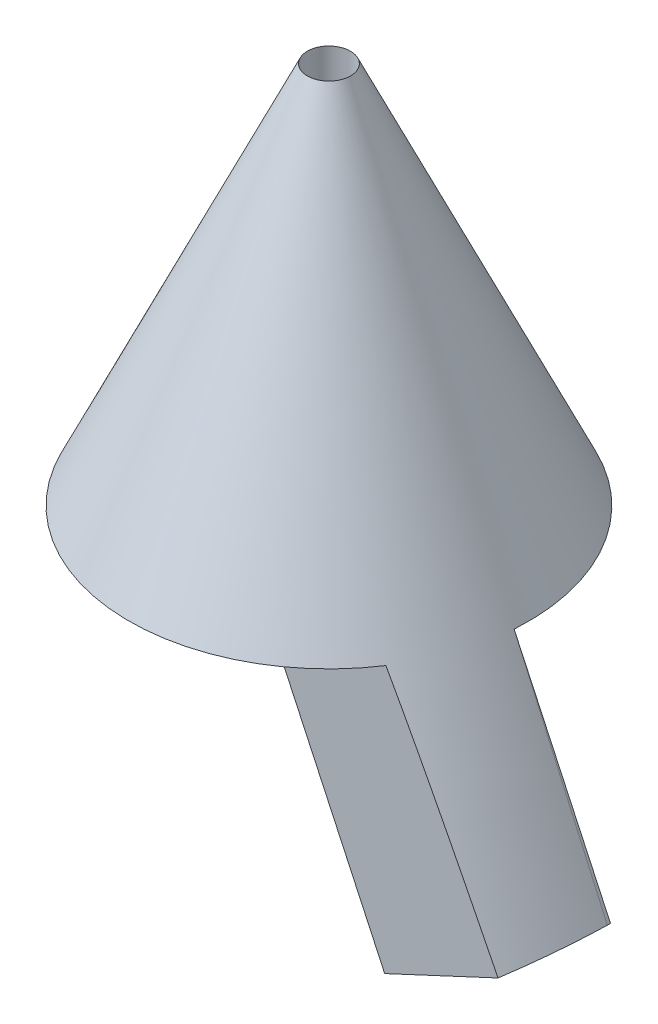
ISO-10303-21;
HEADER;
FILE_DESCRIPTION(('STEP AP214'),'2;1');
FILE_NAME('part.step','',(''),(''),'','','');
FILE_SCHEMA(('AUTOMOTIVE_DESIGN { 1 0 10303 214 1 1 1 1 }'));
ENDSEC;
DATA;
#1=APPLICATION_CONTEXT('core data for automotive mechanical design processes');
#2=APPLICATION_PROTOCOL_DEFINITION('international standard','automotive_design',2000,#1);
#3=PRODUCT_CONTEXT('',#1,'mechanical');
#4=PRODUCT('Part','Part','',(#3));
#5=PRODUCT_RELATED_PRODUCT_CATEGORY('part','',(#4));
#6=PRODUCT_DEFINITION_FORMATION('','',#4);
#7=PRODUCT_DEFINITION_CONTEXT('part definition',#1,'design');
#8=PRODUCT_DEFINITION('design','',#6,#7);
#9=PRODUCT_DEFINITION_SHAPE('','',#8);
#10=(LENGTH_UNIT() NAMED_UNIT(*) SI_UNIT(.MILLI.,.METRE.));
#11=(NAMED_UNIT(*) PLANE_ANGLE_UNIT() SI_UNIT($,.RADIAN.));
#12=(NAMED_UNIT(*) SI_UNIT($,.STERADIAN.) SOLID_ANGLE_UNIT());
#13=UNCERTAINTY_MEASURE_WITH_UNIT(LENGTH_MEASURE(1.E-05),#10,'distance_accuracy_value','');
#14=(GEOMETRIC_REPRESENTATION_CONTEXT(3) GLOBAL_UNCERTAINTY_ASSIGNED_CONTEXT((#13)) GLOBAL_UNIT_ASSIGNED_CONTEXT((#10,
#11,#12)) REPRESENTATION_CONTEXT('',''));
#15=CARTESIAN_POINT('',(0.,0.,0.));
#16=DIRECTION('',(0.,0.,1.));
#17=DIRECTION('',(1.,0.,0.));
#18=AXIS2_PLACEMENT_3D('',#15,#16,#17);
#19=CARTESIAN_POINT('',(30.9189100850161,-21.5962463131786,11.5));
#20=DIRECTION('',(-0.422618261740701,0.906307787036649,0.));
#21=DIRECTION('',(-0.906307787036649,-0.422618261740701,0.));
#22=AXIS2_PLACEMENT_3D('',#19,#20,#21);
#23=PLANE('',#22);
#24=CARTESIAN_POINT('',(-8.6034873437336,-40.02584290285,0.));
#25=DIRECTION('',(-0.422618261740701,0.906307787036649,0.));
#26=DIRECTION('',(-0.906307787036649,-0.422618261740701,0.));
#27=AXIS2_PLACEMENT_3D('',#24,#25,#26);
#28=ELLIPSE('',#27,43.6569827180664,38.6199541404609);
#29=CARTESIAN_POINT('',(29.1682953506833,-22.4125713702769,11.5));
#30=VERTEX_POINT('',#29);
#31=CARTESIAN_POINT('',(30.9189100850161,-21.5962463131786,1.82631427341627));
#32=VERTEX_POINT('',#31);
#33=EDGE_CURVE('E142',#30,#32,#28,.T.);
#34=ORIENTED_EDGE('',*,*,#33,.F.);
#35=DIRECTION('',(0.906307787036649,0.422618261740701,0.));
#36=VECTOR('',#35,1.);
#37=CARTESIAN_POINT('',(30.9189100850161,-21.5962463131786,11.5));
#38=LINE('',#37,#36);
#39=CARTESIAN_POINT('',(17.3242932794663,-27.9355202392891,11.5));
#40=VERTEX_POINT('',#39);
#41=EDGE_CURVE('E153',#40,#30,#38,.T.);
#42=ORIENTED_EDGE('',*,*,#41,.F.);
#43=DIRECTION('',(0.,0.,-1.));
#44=VECTOR('',#43,1.);
#45=CARTESIAN_POINT('',(17.3242932794663,-27.9355202392891,11.5));
#46=LINE('',#45,#44);
#47=CARTESIAN_POINT('',(17.3242932794663,-27.9355202392891,1.5));
#48=VERTEX_POINT('',#47);
#49=EDGE_CURVE('E162',#40,#48,#46,.T.);
#50=ORIENTED_EDGE('',*,*,#49,.T.);
#51=DIRECTION('',(0.906307787036649,0.422618261740701,0.));
#52=VECTOR('',#51,1.);
#53=CARTESIAN_POINT('',(30.9189100850161,-21.5962463131786,1.5));
#54=LINE('',#53,#52);
#55=CARTESIAN_POINT('',(30.9189100850161,-21.5962463131786,1.5));
#56=VERTEX_POINT('',#55);
#57=EDGE_CURVE('E173',#48,#56,#54,.T.);
#58=ORIENTED_EDGE('',*,*,#57,.T.);
#59=DIRECTION('',(0.,0.,-1.));
#60=VECTOR('',#59,1.);
#61=CARTESIAN_POINT('',(30.9189100850161,-21.5962463131786,11.5));
#62=LINE('',#61,#60);
#63=EDGE_CURVE('E155',#32,#56,#62,.T.);
#64=ORIENTED_EDGE('',*,*,#63,.F.);
#65=EDGE_LOOP('',(#34,#42,#50,#58,#64));
#66=FACE_BOUND('',#65,.T.);
#67=ADVANCED_FACE('F37',(#66),#23,.F.);
#68=CARTESIAN_POINT('',(20.8484150417792,0.,11.5));
#69=DIRECTION('',(-0.906307787036649,-0.422618261740701,0.));
#70=DIRECTION('',(0.422618261740701,-0.906307787036649,0.));
#71=AXIS2_PLACEMENT_3D('',#68,#69,#70);
#72=PLANE('',#71);
#73=CARTESIAN_POINT('',(30.9190033465477,-21.5964463131786,1.82631702539581));
#74=CARTESIAN_POINT('',(29.2405257668404,-17.9969395275762,1.77725201658256));
#75=CARTESIAN_POINT('',(27.5620635865221,-14.3974657660699,1.72552615011602));
#76=CARTESIAN_POINT('',(24.2051697310833,-7.19858366166552,1.61675269236349));
#77=CARTESIAN_POINT('',(22.5267380559683,-3.59917531877892,1.55970510014667));
#78=CARTESIAN_POINT('',(20.8483217802476,0.000199999999984483,1.49999664934574));
#79=B_SPLINE_CURVE_WITH_KNOTS('',3,(#73,#74,#75,#76,#77,#78),.UNSPECIFIED.,.F.,.F.,(4,2,4),(0.,
11.9157500788719,23.8315022419474),.UNSPECIFIED.);
#80=CARTESIAN_POINT('',(20.8484150417792,0.,1.50000000000565));
#81=VERTEX_POINT('',#80);
#82=EDGE_CURVE('E156',#32,#81,#79,.T.);
#83=ORIENTED_EDGE('',*,*,#82,.F.);
#84=ORIENTED_EDGE('',*,*,#63,.T.);
#85=DIRECTION('',(-0.422618261740701,0.906307787036649,0.));
#86=VECTOR('',#85,1.);
#87=CARTESIAN_POINT('',(20.8484150417792,0.,1.5));
#88=LINE('',#87,#86);
#89=EDGE_CURVE('E175',#56,#81,#88,.T.);
#90=ORIENTED_EDGE('',*,*,#89,.T.);
#91=EDGE_LOOP('',(#83,#84,#90));
#92=FACE_BOUND('',#91,.T.);
#93=ADVANCED_FACE('F283',(#92),#72,.F.);
#94=CARTESIAN_POINT('',(0.,0.,11.5));
#95=DIRECTION('',(0.,0.,1.));
#96=DIRECTION('',(1.,0.,0.));
#97=AXIS2_PLACEMENT_3D('',#94,#95,#96);
#98=PLANE('',#97);
#99=ORIENTED_EDGE('',*,*,#41,.T.);
#100=CARTESIAN_POINT('',(30.9196100850161,-25.9199386446583,11.5));
#101=CARTESIAN_POINT('',(30.4993022715117,-25.0751443893437,11.5));
#102=CARTESIAN_POINT('',(30.0781731130556,-24.2307580439134,11.5));
#103=CARTESIAN_POINT('',(29.2340260084943,-22.5429271880357,11.5));
#104=CARTESIAN_POINT('',(28.8110080571408,-21.6994826802135,11.5));
#105=CARTESIAN_POINT('',(27.9626894517464,-20.0133677727323,11.5));
#106=CARTESIAN_POINT('',(27.537388042518,-19.1706977528888,11.5));
#107=CARTESIAN_POINT('',(26.6843471599657,-17.4865932164466,11.5));
#108=CARTESIAN_POINT('',(26.2566076888044,-16.6451586987529,11.5));
#109=CARTESIAN_POINT('',(25.3933329554053,-14.9539339212142,11.5));
#110=CARTESIAN_POINT('',(24.9577649017859,-14.1041603925254,11.5));
#111=CARTESIAN_POINT('',(24.0833050067813,-12.4063254464005,11.5));
#112=CARTESIAN_POINT('',(23.6444131686402,-11.5582640272943,11.5));
#113=CARTESIAN_POINT('',(22.7628791378075,-9.86442601698355,11.5));
#114=CARTESIAN_POINT('',(22.3202381519484,-9.01864879808708,11.5));
#115=CARTESIAN_POINT('',(21.4303715304553,-7.32951220263683,11.5));
#116=CARTESIAN_POINT('',(20.9831459133098,-6.48615281635025,11.5));
#117=CARTESIAN_POINT('',(20.0661515864045,-4.77041617508968,11.5));
#118=CARTESIAN_POINT('',(19.5961713217892,-3.89815187070213,11.5));
#119=CARTESIAN_POINT('',(18.6490265434762,-2.15750542302357,11.5));
#120=CARTESIAN_POINT('',(18.1718618954531,-1.28912335271285,11.5));
#121=CARTESIAN_POINT('',(17.2081784139742,0.443569095737328,11.5));
#122=CARTESIAN_POINT('',(16.7216507729627,1.30787458175537,11.5));
#123=CARTESIAN_POINT('',(15.7374261106548,3.0300595091718,11.5));
#124=CARTESIAN_POINT('',(15.2397297544072,3.88793932915504,11.5));
#125=CARTESIAN_POINT('',(14.4838298850276,5.16581232317549,11.5));
#126=CARTESIAN_POINT('',(14.2310725190876,5.5890284348417,11.5));
#127=CARTESIAN_POINT('',(13.7214420443635,6.43297331759146,11.5));
#128=CARTESIAN_POINT('',(13.4645689744777,6.85370211213173,11.5));
#129=CARTESIAN_POINT('',(12.9460006131209,7.69234035344263,11.5));
#130=CARTESIAN_POINT('',(12.6843040190365,8.11024899572816,11.5));
#131=CARTESIAN_POINT('',(12.1553735853242,8.94254695735617,11.5));
#132=CARTESIAN_POINT('',(11.8881398052547,9.35693631448481,11.5));
#133=CARTESIAN_POINT('',(11.3476159981426,10.1807466340659,11.5));
#134=CARTESIAN_POINT('',(11.0743370424325,10.5901748469451,11.5));
#135=CARTESIAN_POINT('',(10.5200447703971,11.4038077299894,11.5));
#136=CARTESIAN_POINT('',(10.2390310650453,11.8080121359102,11.5));
#137=CARTESIAN_POINT('',(9.66785923074975,12.6096155950066,11.5));
#138=CARTESIAN_POINT('',(9.37770578350211,13.0070179764403,11.5));
#139=CARTESIAN_POINT('',(8.78611871068477,13.7933108425807,11.5));
#140=CARTESIAN_POINT('',(8.48468673961861,14.1822025625968,11.5));
#141=CARTESIAN_POINT('',(8.0711159611358,14.696106515212,11.5));
#142=CARTESIAN_POINT('',(7.96515679885634,14.8261059277131,11.5));
#143=CARTESIAN_POINT('',(7.75146523801096,15.0846551989408,11.5));
#144=CARTESIAN_POINT('',(7.64373272718631,15.2132049650255,11.5));
#145=CARTESIAN_POINT('',(7.42634272016583,15.4687050602101,11.5));
#146=CARTESIAN_POINT('',(7.31668491102073,15.5956551234152,11.5));
#147=CARTESIAN_POINT('',(7.09530419592352,15.847737086967,11.5));
#148=CARTESIAN_POINT('',(6.98358131064065,15.972869005489,11.5));
#149=CARTESIAN_POINT('',(6.6431177597732,16.3473519524986,11.5));
#150=CARTESIAN_POINT('',(6.41093295769908,16.5936003798105,11.5));
#151=CARTESIAN_POINT('',(5.93580219290301,17.0755251925169,11.5));
#152=CARTESIAN_POINT('',(5.69285665468072,17.3112019942139,11.5));
#153=CARTESIAN_POINT('',(5.18934437113635,17.7731855455576,11.5));
#154=CARTESIAN_POINT('',(4.92852715469477,17.9992216932927,11.5));
#155=CARTESIAN_POINT('',(4.39099540483391,18.4321269079677,11.5));
#156=CARTESIAN_POINT('',(4.11427189122446,18.6389849719252,11.5));
#157=CARTESIAN_POINT('',(3.54703866494316,19.0232261347467,11.5));
#158=CARTESIAN_POINT('',(3.25680683751823,19.2010140378656,11.5));
#159=CARTESIAN_POINT('',(2.65741738743096,19.5210407425049,11.5));
#160=CARTESIAN_POINT('',(2.34829542774495,19.6633441026763,11.5));
#161=CARTESIAN_POINT('',(1.86991454104257,19.8417196618961,11.5));
#162=CARTESIAN_POINT('',(1.70720324715158,19.8955006386071,11.5));
#163=CARTESIAN_POINT('',(1.37792099449886,19.9893734430024,11.5));
#164=CARTESIAN_POINT('',(1.21135202505031,20.0294721655423,11.5));
#165=CARTESIAN_POINT('',(0.871563792526983,20.0953019491869,11.5));
#166=CARTESIAN_POINT('',(0.698278733314009,20.1207002160779,11.5));
#167=CARTESIAN_POINT('',(0.437008051507747,20.1462199314947,11.5));
#168=CARTESIAN_POINT('',(0.349601226363228,20.1526303224303,11.5));
#169=CARTESIAN_POINT('',(0.174567677416204,20.1611844024207,11.5));
#170=CARTESIAN_POINT('',(0.0869409257893005,20.1633275211981,11.5));
#171=CARTESIAN_POINT('',(-0.000700000000000792,20.1633109395994,11.5));
#172=B_SPLINE_CURVE_WITH_KNOTS('',3,(#100,#101,#102,#103,#104,#105,#106,#107,#108,#109,#110,
#111,#112,#113,#114,#115,#116,#117,#118,#119,#120,#121,#122,#123,#124,#125,#126,#127,#128,#129,
#130,#131,#132,#133,#134,#135,#136,#137,#138,#139,#140,#141,#142,#143,#144,#145,#146,#147,#148,
#149,#150,#151,#152,#153,#154,#155,#156,#157,#158,#159,#160,#161,#162,#163,#164,#165,#166,#167,
#168,#169,#170,#171),.UNSPECIFIED.,.F.,.F.,(4,2,2,2,2,2,2,2,2,2,2,2,2,2,2,2,2,2,2,2,2,2,2,2,2,2,
2,2,2,2,2,2,2,2,2,4),(0.,2.8307290419502,5.66146595444674,8.49320512133687,11.3249417768468,
14.1896364103141,17.0543282480368,19.918130574916,22.7819213575149,25.7543578325351,
28.7268499519812,31.702289993201,34.6775533274567,36.1563800758951,37.6351928559038,
39.1144110231972,40.5936132881704,42.0703001857377,43.5470614908445,45.0230782694166,
46.4988793660765,47.0020022354621,47.5051570775873,48.0083944768474,48.511626841952,
49.5266884970054,50.5417101445527,51.5764299866218,52.6117398484321,53.631108257266,
54.6486083245951,55.1622180055891,55.6755684812873,56.2001266451393,56.4629598368779,
56.725828151234),.UNSPECIFIED.);
#173=CARTESIAN_POINT('',(17.4544094644959,0.,11.5));
#174=VERTEX_POINT('',#173);
#175=EDGE_CURVE('E11',#30,#174,#172,.T.);
#176=ORIENTED_EDGE('',*,*,#175,.T.);
#177=DIRECTION('',(-1.,0.,0.));
#178=VECTOR('',#177,1.);
#179=CARTESIAN_POINT('',(20.8484150417792,0.,11.5));
#180=LINE('',#179,#178);
#181=CARTESIAN_POINT('',(4.29774625734182,0.,11.5));
#182=VERTEX_POINT('',#181);
#183=EDGE_CURVE('E164',#174,#182,#180,.T.);
#184=ORIENTED_EDGE('',*,*,#183,.T.);
#185=DIRECTION('',(0.422618261740701,-0.906307787036649,0.));
#186=VECTOR('',#185,1.);
#187=CARTESIAN_POINT('',(4.29774625734182,0.,11.5));
#188=LINE('',#187,#186);
#189=EDGE_CURVE('E159',#182,#40,#188,.T.);
#190=ORIENTED_EDGE('',*,*,#189,.T.);
#191=EDGE_LOOP('',(#99,#176,#184,#190));
#192=FACE_BOUND('',#191,.T.);
#193=ADVANCED_FACE('F158',(#192),#98,.T.);
#194=CARTESIAN_POINT('',(20.9023063261996,0.,0.));
#195=DIRECTION('',(0.,1.,0.));
#196=DIRECTION('',(-1.,0.,0.));
#197=AXIS2_PLACEMENT_3D('',#194,#195,#196);
#198=PLANE('',#197);
#199=CARTESIAN_POINT('',(0.,0.,0.));
#200=DIRECTION('',(0.,1.,0.));
#201=DIRECTION('',(-1.,0.,0.));
#202=AXIS2_PLACEMENT_3D('',#199,#200,#201);
#203=CIRCLE('',#202,2.25);
#204=CARTESIAN_POINT('',(-2.24999999999999,0.,0.));
#205=VERTEX_POINT('',#204);
#206=EDGE_CURVE('E248',#205,#205,#203,.T.);
#207=ORIENTED_EDGE('',*,*,#206,.T.);
#208=EDGE_LOOP('',(#207));
#209=FACE_BOUND('',#208,.T.);
#210=DIRECTION('',(0.,0.,1.));
#211=VECTOR('',#210,1.);
#212=CARTESIAN_POINT('',(13.21,0.,-3.5));
#213=LINE('',#212,#211);
#214=CARTESIAN_POINT('',(13.21,0.,-3.5));
#215=VERTEX_POINT('',#214);
#216=CARTESIAN_POINT('',(13.21,0.,-0.5));
#217=VERTEX_POINT('',#216);
#218=EDGE_CURVE('E210',#215,#217,#213,.T.);
#219=ORIENTED_EDGE('',*,*,#218,.F.);
#220=DIRECTION('',(-1.,0.,0.));
#221=VECTOR('',#220,1.);
#222=CARTESIAN_POINT('',(3.67082008319615,0.,-3.5));
#223=LINE('',#222,#221);
#224=CARTESIAN_POINT('',(3.67082008319615,0.,-3.5));
#225=VERTEX_POINT('',#224);
#226=EDGE_CURVE('E66',#215,#225,#223,.T.);
#227=ORIENTED_EDGE('',*,*,#226,.T.);
#228=DIRECTION('',(0.,0.,1.));
#229=VECTOR('',#228,1.);
#230=CARTESIAN_POINT('',(3.67082008319615,0.,-3.5));
#231=LINE('',#230,#229);
#232=CARTESIAN_POINT('',(3.67082008319615,0.,-0.5));
#233=VERTEX_POINT('',#232);
#234=EDGE_CURVE('E213',#225,#233,#231,.T.);
#235=ORIENTED_EDGE('',*,*,#234,.T.);
#236=DIRECTION('',(-1.,0.,0.));
#237=VECTOR('',#236,1.);
#238=CARTESIAN_POINT('',(3.67082008319615,0.,-0.5));
#239=LINE('',#238,#237);
#240=EDGE_CURVE('E199',#217,#233,#239,.T.);
#241=ORIENTED_EDGE('',*,*,#240,.F.);
#242=EDGE_LOOP('',(#219,#227,#235,#241));
#243=FACE_BOUND('',#242,.T.);
#244=DIRECTION('',(0.,0.,-1.));
#245=VECTOR('',#244,1.);
#246=CARTESIAN_POINT('',(4.29774625734182,0.,11.5));
#247=LINE('',#246,#245);
#248=CARTESIAN_POINT('',(4.29774625734183,0.,3.5));
#249=VERTEX_POINT('',#248);
#250=EDGE_CURVE('E58',#182,#249,#247,.T.);
#251=ORIENTED_EDGE('',*,*,#250,.F.);
#252=ORIENTED_EDGE('',*,*,#183,.F.);
#253=CARTESIAN_POINT('',(0.,0.,0.));
#254=DIRECTION('',(0.,1.,0.));
#255=DIRECTION('',(-1.,0.,0.));
#256=AXIS2_PLACEMENT_3D('',#253,#254,#255);
#257=CIRCLE('',#256,20.9023063261996);
#258=EDGE_CURVE('E145',#81,#174,#257,.T.);
#259=ORIENTED_EDGE('',*,*,#258,.F.);
#260=DIRECTION('',(-1.,0.,0.));
#261=VECTOR('',#260,1.);
#262=CARTESIAN_POINT('',(20.8484150417792,0.,1.5));
#263=LINE('',#262,#261);
#264=CARTESIAN_POINT('',(13.21,0.,1.5));
#265=VERTEX_POINT('',#264);
#266=EDGE_CURVE('E168',#81,#265,#263,.T.);
#267=ORIENTED_EDGE('',*,*,#266,.T.);
#268=DIRECTION('',(0.,0.,-1.));
#269=VECTOR('',#268,1.);
#270=CARTESIAN_POINT('',(13.21,0.,3.5));
#271=LINE('',#270,#269);
#272=CARTESIAN_POINT('',(13.21,0.,0.5));
#273=VERTEX_POINT('',#272);
#274=EDGE_CURVE('E237',#265,#273,#271,.T.);
#275=ORIENTED_EDGE('',*,*,#274,.T.);
#276=DIRECTION('',(-1.,0.,0.));
#277=VECTOR('',#276,1.);
#278=CARTESIAN_POINT('',(3.67082008319615,0.,0.5));
#279=LINE('',#278,#277);
#280=CARTESIAN_POINT('',(3.67082008319615,0.,0.5));
#281=VERTEX_POINT('',#280);
#282=EDGE_CURVE('E220',#273,#281,#279,.T.);
#283=ORIENTED_EDGE('',*,*,#282,.T.);
#284=DIRECTION('',(0.,0.,-1.));
#285=VECTOR('',#284,1.);
#286=CARTESIAN_POINT('',(3.67082008319615,0.,3.5));
#287=LINE('',#286,#285);
#288=CARTESIAN_POINT('',(3.67082008319615,0.,3.5));
#289=VERTEX_POINT('',#288);
#290=EDGE_CURVE('E225',#289,#281,#287,.T.);
#291=ORIENTED_EDGE('',*,*,#290,.F.);
#292=DIRECTION('',(-1.,0.,0.));
#293=VECTOR('',#292,1.);
#294=CARTESIAN_POINT('',(3.67082008319615,0.,3.5));
#295=LINE('',#294,#293);
#296=EDGE_CURVE('E223',#249,#289,#295,.T.);
#297=ORIENTED_EDGE('',*,*,#296,.F.);
#298=EDGE_LOOP('',(#251,#252,#259,#267,#275,#283,#291,#297));
#299=FACE_BOUND('',#298,.T.);
#300=ADVANCED_FACE('F39',(#209,#243,#299),#198,.F.);
#301=CARTESIAN_POINT('',(3.67082008319615,-12.2,3.5));
#302=DIRECTION('',(0.,1.,0.));
#303=DIRECTION('',(0.,0.,1.));
#304=AXIS2_PLACEMENT_3D('',#301,#302,#303);
#305=PLANE('',#304);
#306=DIRECTION('',(0.,0.,-1.));
#307=VECTOR('',#306,1.);
#308=CARTESIAN_POINT('',(9.98669968683283,-12.2,3.5));
#309=LINE('',#308,#307);
#310=CARTESIAN_POINT('',(9.98669968683283,-12.2,3.5));
#311=VERTEX_POINT('',#310);
#312=CARTESIAN_POINT('',(9.98669968683283,-12.2,1.5));
#313=VERTEX_POINT('',#312);
#314=EDGE_CURVE('E180',#311,#313,#309,.T.);
#315=ORIENTED_EDGE('',*,*,#314,.F.);
#316=DIRECTION('',(1.,0.,0.));
#317=VECTOR('',#316,1.);
#318=CARTESIAN_POINT('',(3.67082008319615,-12.2,3.5));
#319=LINE('',#318,#317);
#320=CARTESIAN_POINT('',(3.67082008319615,-12.2,3.5));
#321=VERTEX_POINT('',#320);
#322=EDGE_CURVE('E219',#321,#311,#319,.T.);
#323=ORIENTED_EDGE('',*,*,#322,.F.);
#324=DIRECTION('',(0.,0.,-1.));
#325=VECTOR('',#324,1.);
#326=CARTESIAN_POINT('',(3.67082008319615,-12.2,3.5));
#327=LINE('',#326,#325);
#328=CARTESIAN_POINT('',(3.67082008319615,-12.2,0.5));
#329=VERTEX_POINT('',#328);
#330=EDGE_CURVE('E241',#321,#329,#327,.T.);
#331=ORIENTED_EDGE('',*,*,#330,.T.);
#332=DIRECTION('',(1.,0.,0.));
#333=VECTOR('',#332,1.);
#334=CARTESIAN_POINT('',(3.67082008319615,-12.2,0.5));
#335=LINE('',#334,#333);
#336=CARTESIAN_POINT('',(13.21,-12.2,0.5));
#337=VERTEX_POINT('',#336);
#338=EDGE_CURVE('E228',#329,#337,#335,.T.);
#339=ORIENTED_EDGE('',*,*,#338,.T.);
#340=DIRECTION('',(0.,0.,-1.));
#341=VECTOR('',#340,1.);
#342=CARTESIAN_POINT('',(13.21,-12.2,3.5));
#343=LINE('',#342,#341);
#344=CARTESIAN_POINT('',(13.21,-12.2,1.5));
#345=VERTEX_POINT('',#344);
#346=EDGE_CURVE('E239',#345,#337,#343,.T.);
#347=ORIENTED_EDGE('',*,*,#346,.F.);
#348=DIRECTION('',(1.,0.,0.));
#349=VECTOR('',#348,1.);
#350=CARTESIAN_POINT('',(3.67082008319615,-12.2,1.5));
#351=LINE('',#350,#349);
#352=EDGE_CURVE('E182',#313,#345,#351,.T.);
#353=ORIENTED_EDGE('',*,*,#352,.F.);
#354=EDGE_LOOP('',(#315,#323,#331,#339,#347,#353));
#355=FACE_BOUND('',#354,.T.);
#356=ADVANCED_FACE('F330',(#355),#305,.F.);
#357=CARTESIAN_POINT('',(13.21,0.,3.5));
#358=DIRECTION('',(-1.,0.,0.));
#359=DIRECTION('',(0.,-1.,0.));
#360=AXIS2_PLACEMENT_3D('',#357,#358,#359);
#361=PLANE('',#360);
#362=DIRECTION('',(0.,1.,0.));
#363=VECTOR('',#362,1.);
#364=CARTESIAN_POINT('',(13.21,0.,1.5));
#365=LINE('',#364,#363);
#366=EDGE_CURVE('E51',#345,#265,#365,.T.);
#367=ORIENTED_EDGE('',*,*,#366,.F.);
#368=ORIENTED_EDGE('',*,*,#346,.T.);
#369=DIRECTION('',(0.,1.,0.));
#370=VECTOR('',#369,1.);
#371=CARTESIAN_POINT('',(13.21,0.,0.5));
#372=LINE('',#371,#370);
#373=EDGE_CURVE('E231',#337,#273,#372,.T.);
#374=ORIENTED_EDGE('',*,*,#373,.T.);
#375=ORIENTED_EDGE('',*,*,#274,.F.);
#376=EDGE_LOOP('',(#367,#368,#374,#375));
#377=FACE_BOUND('',#376,.T.);
#378=ADVANCED_FACE('F263',(#377),#361,.F.);
#379=CARTESIAN_POINT('',(0.,0.,3.5));
#380=DIRECTION('',(0.,0.,1.));
#381=DIRECTION('',(1.,0.,0.));
#382=AXIS2_PLACEMENT_3D('',#379,#380,#381);
#383=PLANE('',#382);
#384=ORIENTED_EDGE('',*,*,#322,.T.);
#385=DIRECTION('',(-0.422618261740701,0.906307787036649,0.));
#386=VECTOR('',#385,1.);
#387=CARTESIAN_POINT('',(3.53014215056892,1.64613231918605,3.5));
#388=LINE('',#387,#386);
#389=EDGE_CURVE('E251',#311,#249,#388,.T.);
#390=ORIENTED_EDGE('',*,*,#389,.T.);
#391=ORIENTED_EDGE('',*,*,#296,.T.);
#392=DIRECTION('',(0.,-1.,0.));
#393=VECTOR('',#392,1.);
#394=CARTESIAN_POINT('',(3.67082008319615,0.,3.5));
#395=LINE('',#394,#393);
#396=EDGE_CURVE('E216',#289,#321,#395,.T.);
#397=ORIENTED_EDGE('',*,*,#396,.T.);
#398=EDGE_LOOP('',(#384,#390,#391,#397));
#399=FACE_BOUND('',#398,.T.);
#400=ADVANCED_FACE('F276',(#399),#383,.T.);
#401=CARTESIAN_POINT('',(0.,21.4294264714433,0.));
#402=DIRECTION('',(0.,1.,0.));
#403=DIRECTION('',(-1.,0.,0.));
#404=AXIS2_PLACEMENT_3D('',#401,#402,#403);
#405=CYLINDRICAL_SURFACE('',#404,2.25);
#406=ORIENTED_EDGE('',*,*,#206,.F.);
#407=EDGE_LOOP('',(#406));
#408=FACE_BOUND('',#407,.T.);
#409=CARTESIAN_POINT('',(0.,40.,0.));
#410=DIRECTION('',(0.,1.,0.));
#411=DIRECTION('',(-1.,0.,0.));
#412=AXIS2_PLACEMENT_3D('',#409,#410,#411);
#413=CIRCLE('',#412,2.25000000000001);
#414=CARTESIAN_POINT('',(-2.25000000000001,40.,0.));
#415=VERTEX_POINT('',#414);
#416=EDGE_CURVE('E245',#415,#415,#413,.T.);
#417=ORIENTED_EDGE('',*,*,#416,.T.);
#418=EDGE_LOOP('',(#417));
#419=FACE_BOUND('',#418,.T.);
#420=ADVANCED_FACE('F325',(#408,#419),#405,.F.);
#421=CARTESIAN_POINT('',(0.,0.,0.));
#422=DIRECTION('',(0.,-1.,0.));
#423=DIRECTION('',(1.,0.,0.));
#424=AXIS2_PLACEMENT_3D('',#421,#422,#423);
#425=CONICAL_SURFACE('',#424,20.9023063261996,0.436332312998576);
#426=ORIENTED_EDGE('',*,*,#416,.F.);
#427=EDGE_LOOP('',(#426));
#428=FACE_BOUND('',#427,.T.);
#429=ORIENTED_EDGE('',*,*,#258,.T.);
#430=ORIENTED_EDGE('',*,*,#175,.F.);
#431=ORIENTED_EDGE('',*,*,#33,.T.);
#432=ORIENTED_EDGE('',*,*,#82,.T.);
#433=EDGE_LOOP('',(#429,#430,#431,#432));
#434=FACE_BOUND('',#433,.T.);
#435=ADVANCED_FACE('F141',(#428,#434),#425,.T.);
#436=CARTESIAN_POINT('',(3.67082008319615,0.,3.5));
#437=DIRECTION('',(1.,0.,0.));
#438=DIRECTION('',(0.,1.,0.));
#439=AXIS2_PLACEMENT_3D('',#436,#437,#438);
#440=PLANE('',#439);
#441=DIRECTION('',(0.,-1.,0.));
#442=VECTOR('',#441,1.);
#443=CARTESIAN_POINT('',(3.67082008319615,0.,0.5));
#444=LINE('',#443,#442);
#445=EDGE_CURVE('E215',#281,#329,#444,.T.);
#446=ORIENTED_EDGE('',*,*,#445,.T.);
#447=ORIENTED_EDGE('',*,*,#330,.F.);
#448=ORIENTED_EDGE('',*,*,#396,.F.);
#449=ORIENTED_EDGE('',*,*,#290,.T.);
#450=EDGE_LOOP('',(#446,#447,#448,#449));
#451=FACE_BOUND('',#450,.T.);
#452=ADVANCED_FACE('F273',(#451),#440,.F.);
#453=CARTESIAN_POINT('',(0.,0.,0.5));
#454=DIRECTION('',(0.,0.,1.));
#455=DIRECTION('',(1.,0.,0.));
#456=AXIS2_PLACEMENT_3D('',#453,#454,#455);
#457=PLANE('',#456);
#458=ORIENTED_EDGE('',*,*,#445,.F.);
#459=ORIENTED_EDGE('',*,*,#282,.F.);
#460=ORIENTED_EDGE('',*,*,#373,.F.);
#461=ORIENTED_EDGE('',*,*,#338,.F.);
#462=EDGE_LOOP('',(#458,#459,#460,#461));
#463=FACE_BOUND('',#462,.T.);
#464=ADVANCED_FACE('F268',(#463),#457,.F.);
#465=CARTESIAN_POINT('',(3.67082008319615,0.,-3.5));
#466=DIRECTION('',(-1.,0.,0.));
#467=DIRECTION('',(0.,-1.,0.));
#468=AXIS2_PLACEMENT_3D('',#465,#466,#467);
#469=PLANE('',#468);
#470=DIRECTION('',(0.,-1.,0.));
#471=VECTOR('',#470,1.);
#472=CARTESIAN_POINT('',(3.67082008319615,0.,-0.5));
#473=LINE('',#472,#471);
#474=CARTESIAN_POINT('',(3.67082008319615,-12.2,-0.5));
#475=VERTEX_POINT('',#474);
#476=EDGE_CURVE('E184',#233,#475,#473,.T.);
#477=ORIENTED_EDGE('',*,*,#476,.F.);
#478=ORIENTED_EDGE('',*,*,#234,.F.);
#479=DIRECTION('',(0.,-1.,0.));
#480=VECTOR('',#479,1.);
#481=CARTESIAN_POINT('',(3.67082008319615,0.,-3.5));
#482=LINE('',#481,#480);
#483=CARTESIAN_POINT('',(3.67082008319615,-12.2,-3.5));
#484=VERTEX_POINT('',#483);
#485=EDGE_CURVE('E185',#225,#484,#482,.T.);
#486=ORIENTED_EDGE('',*,*,#485,.T.);
#487=DIRECTION('',(0.,0.,1.));
#488=VECTOR('',#487,1.);
#489=CARTESIAN_POINT('',(3.67082008319615,-12.2,-3.5));
#490=LINE('',#489,#488);
#491=EDGE_CURVE('E196',#484,#475,#490,.T.);
#492=ORIENTED_EDGE('',*,*,#491,.T.);
#493=EDGE_LOOP('',(#477,#478,#486,#492));
#494=FACE_BOUND('',#493,.T.);
#495=ADVANCED_FACE('F318',(#494),#469,.T.);
#496=CARTESIAN_POINT('',(13.21,0.,-3.5));
#497=DIRECTION('',(1.,0.,0.));
#498=DIRECTION('',(0.,1.,0.));
#499=AXIS2_PLACEMENT_3D('',#496,#497,#498);
#500=PLANE('',#499);
#501=DIRECTION('',(0.,1.,0.));
#502=VECTOR('',#501,1.);
#503=CARTESIAN_POINT('',(13.21,0.,-0.5));
#504=LINE('',#503,#502);
#505=CARTESIAN_POINT('',(13.21,-12.2,-0.5));
#506=VERTEX_POINT('',#505);
#507=EDGE_CURVE('E202',#506,#217,#504,.T.);
#508=ORIENTED_EDGE('',*,*,#507,.F.);
#509=DIRECTION('',(0.,0.,1.));
#510=VECTOR('',#509,1.);
#511=CARTESIAN_POINT('',(13.21,-12.2,-3.5));
#512=LINE('',#511,#510);
#513=CARTESIAN_POINT('',(13.21,-12.2,-3.5));
#514=VERTEX_POINT('',#513);
#515=EDGE_CURVE('E208',#514,#506,#512,.T.);
#516=ORIENTED_EDGE('',*,*,#515,.F.);
#517=DIRECTION('',(0.,1.,0.));
#518=VECTOR('',#517,1.);
#519=CARTESIAN_POINT('',(13.21,0.,-3.5));
#520=LINE('',#519,#518);
#521=EDGE_CURVE('E190',#514,#215,#520,.T.);
#522=ORIENTED_EDGE('',*,*,#521,.T.);
#523=ORIENTED_EDGE('',*,*,#218,.T.);
#524=EDGE_LOOP('',(#508,#516,#522,#523));
#525=FACE_BOUND('',#524,.T.);
#526=ADVANCED_FACE('F314',(#525),#500,.T.);
#527=CARTESIAN_POINT('',(3.67082008319615,-12.2,-3.5));
#528=DIRECTION('',(0.,-1.,0.));
#529=DIRECTION('',(0.,0.,-1.));
#530=AXIS2_PLACEMENT_3D('',#527,#528,#529);
#531=PLANE('',#530);
#532=DIRECTION('',(1.,0.,0.));
#533=VECTOR('',#532,1.);
#534=CARTESIAN_POINT('',(3.67082008319615,-12.2,-0.5));
#535=LINE('',#534,#533);
#536=EDGE_CURVE('E188',#475,#506,#535,.T.);
#537=ORIENTED_EDGE('',*,*,#536,.F.);
#538=ORIENTED_EDGE('',*,*,#491,.F.);
#539=DIRECTION('',(1.,0.,0.));
#540=VECTOR('',#539,1.);
#541=CARTESIAN_POINT('',(3.67082008319615,-12.2,-3.5));
#542=LINE('',#541,#540);
#543=EDGE_CURVE('E193',#484,#514,#542,.T.);
#544=ORIENTED_EDGE('',*,*,#543,.T.);
#545=ORIENTED_EDGE('',*,*,#515,.T.);
#546=EDGE_LOOP('',(#537,#538,#544,#545));
#547=FACE_BOUND('',#546,.T.);
#548=ADVANCED_FACE('F309',(#547),#531,.T.);
#549=CARTESIAN_POINT('',(0.,0.,-3.5));
#550=DIRECTION('',(0.,0.,-1.));
#551=DIRECTION('',(1.,0.,0.));
#552=AXIS2_PLACEMENT_3D('',#549,#550,#551);
#553=PLANE('',#552);
#554=ORIENTED_EDGE('',*,*,#485,.F.);
#555=ORIENTED_EDGE('',*,*,#226,.F.);
#556=ORIENTED_EDGE('',*,*,#521,.F.);
#557=ORIENTED_EDGE('',*,*,#543,.F.);
#558=EDGE_LOOP('',(#554,#555,#556,#557));
#559=FACE_BOUND('',#558,.T.);
#560=ADVANCED_FACE('F299',(#559),#553,.T.);
#561=CARTESIAN_POINT('',(0.,0.,-0.5));
#562=DIRECTION('',(0.,0.,-1.));
#563=DIRECTION('',(1.,0.,0.));
#564=AXIS2_PLACEMENT_3D('',#561,#562,#563);
#565=PLANE('',#564);
#566=ORIENTED_EDGE('',*,*,#476,.T.);
#567=ORIENTED_EDGE('',*,*,#536,.T.);
#568=ORIENTED_EDGE('',*,*,#507,.T.);
#569=ORIENTED_EDGE('',*,*,#240,.T.);
#570=EDGE_LOOP('',(#566,#567,#568,#569));
#571=FACE_BOUND('',#570,.T.);
#572=ADVANCED_FACE('F293',(#571),#565,.F.);
#573=CARTESIAN_POINT('',(0.,0.,1.5));
#574=DIRECTION('',(0.,0.,1.));
#575=DIRECTION('',(1.,0.,0.));
#576=AXIS2_PLACEMENT_3D('',#573,#574,#575);
#577=PLANE('',#576);
#578=DIRECTION('',(0.422618261740701,-0.906307787036649,0.));
#579=VECTOR('',#578,1.);
#580=CARTESIAN_POINT('',(4.29774625734182,0.,1.5));
#581=LINE('',#580,#579);
#582=EDGE_CURVE('E171',#313,#48,#581,.T.);
#583=ORIENTED_EDGE('',*,*,#582,.F.);
#584=ORIENTED_EDGE('',*,*,#352,.T.);
#585=ORIENTED_EDGE('',*,*,#366,.T.);
#586=ORIENTED_EDGE('',*,*,#266,.F.);
#587=ORIENTED_EDGE('',*,*,#89,.F.);
#588=ORIENTED_EDGE('',*,*,#57,.F.);
#589=EDGE_LOOP('',(#583,#584,#585,#586,#587,#588));
#590=FACE_BOUND('',#589,.T.);
#591=ADVANCED_FACE('F256',(#590),#577,.F.);
#592=CARTESIAN_POINT('',(4.29774625734182,0.,11.5));
#593=DIRECTION('',(0.906307787036649,0.422618261740701,0.));
#594=DIRECTION('',(-0.422618261740701,0.906307787036649,0.));
#595=AXIS2_PLACEMENT_3D('',#592,#593,#594);
#596=PLANE('',#595);
#597=ORIENTED_EDGE('',*,*,#389,.F.);
#598=ORIENTED_EDGE('',*,*,#314,.T.);
#599=ORIENTED_EDGE('',*,*,#582,.T.);
#600=ORIENTED_EDGE('',*,*,#49,.F.);
#601=ORIENTED_EDGE('',*,*,#189,.F.);
#602=ORIENTED_EDGE('',*,*,#250,.T.);
#603=EDGE_LOOP('',(#597,#598,#599,#600,#601,#602));
#604=FACE_BOUND('',#603,.T.);
#605=ADVANCED_FACE('F292',(#604),#596,.F.);
#606=CLOSED_SHELL('',(#67,#93,#193,#300,#356,#378,#400,#420,#435,#452,#464,#495,#526,#548,#560,
#572,#591,#605));
#607=MANIFOLD_SOLID_BREP('B2',#606);
#608=ADVANCED_BREP_SHAPE_REPRESENTATION('',(#18,#607),#14);
#609=SHAPE_DEFINITION_REPRESENTATION(#9,#608);
ENDSEC;
END-ISO-10303-21;
